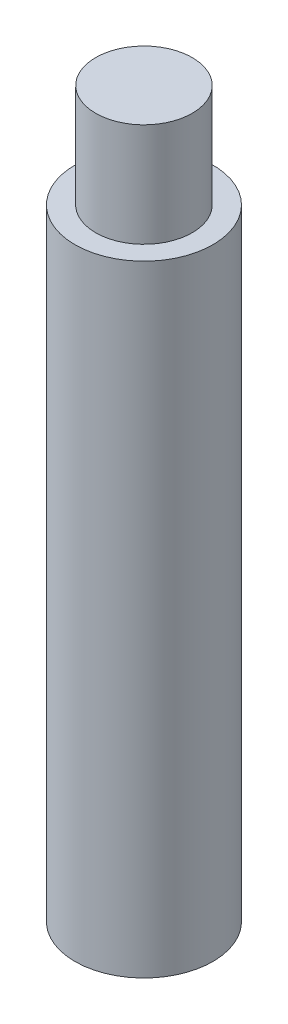
ISO-10303-21;
HEADER;
FILE_DESCRIPTION(('STEP AP214'),'2;1');
FILE_NAME('part.step','',(''),(''),'','','');
FILE_SCHEMA(('AUTOMOTIVE_DESIGN { 1 0 10303 214 1 1 1 1 }'));
ENDSEC;
DATA;
#1=APPLICATION_CONTEXT('core data for automotive mechanical design processes');
#2=APPLICATION_PROTOCOL_DEFINITION('international standard','automotive_design',2000,#1);
#3=PRODUCT_CONTEXT('',#1,'mechanical');
#4=PRODUCT('Part','Part','',(#3));
#5=PRODUCT_RELATED_PRODUCT_CATEGORY('part','',(#4));
#6=PRODUCT_DEFINITION_FORMATION('','',#4);
#7=PRODUCT_DEFINITION_CONTEXT('part definition',#1,'design');
#8=PRODUCT_DEFINITION('design','',#6,#7);
#9=PRODUCT_DEFINITION_SHAPE('','',#8);
#10=(LENGTH_UNIT() NAMED_UNIT(*) SI_UNIT(.MILLI.,.METRE.));
#11=(NAMED_UNIT(*) PLANE_ANGLE_UNIT() SI_UNIT($,.RADIAN.));
#12=(NAMED_UNIT(*) SI_UNIT($,.STERADIAN.) SOLID_ANGLE_UNIT());
#13=UNCERTAINTY_MEASURE_WITH_UNIT(LENGTH_MEASURE(1.E-05),#10,'distance_accuracy_value','');
#14=(GEOMETRIC_REPRESENTATION_CONTEXT(3) GLOBAL_UNCERTAINTY_ASSIGNED_CONTEXT((#13)) GLOBAL_UNIT_ASSIGNED_CONTEXT((#10,
#11,#12)) REPRESENTATION_CONTEXT('',''));
#15=CARTESIAN_POINT('',(0.,0.,0.));
#16=DIRECTION('',(0.,0.,1.));
#17=DIRECTION('',(1.,0.,0.));
#18=AXIS2_PLACEMENT_3D('',#15,#16,#17);
#19=CARTESIAN_POINT('',(0.,0.,0.));
#20=DIRECTION('',(0.,1.,0.));
#21=DIRECTION('',(0.,0.,1.));
#22=AXIS2_PLACEMENT_3D('',#19,#20,#21);
#23=PLANE('',#22);
#24=CARTESIAN_POINT('',(0.,0.,0.));
#25=DIRECTION('',(0.,1.,0.));
#26=DIRECTION('',(0.,0.,1.));
#27=AXIS2_PLACEMENT_3D('',#24,#25,#26);
#28=CIRCLE('',#27,2.);
#29=CARTESIAN_POINT('',(0.,0.,2.));
#30=VERTEX_POINT('',#29);
#31=EDGE_CURVE('E42',#30,#30,#28,.T.);
#32=ORIENTED_EDGE('',*,*,#31,.T.);
#33=EDGE_LOOP('',(#32));
#34=FACE_BOUND('',#33,.T.);
#35=CARTESIAN_POINT('',(0.,0.,0.));
#36=DIRECTION('',(0.,1.,0.));
#37=DIRECTION('',(0.,0.,1.));
#38=AXIS2_PLACEMENT_3D('',#35,#36,#37);
#39=CIRCLE('',#38,1.4);
#40=CARTESIAN_POINT('',(0.,0.,1.4));
#41=VERTEX_POINT('',#40);
#42=EDGE_CURVE('E58',#41,#41,#39,.T.);
#43=ORIENTED_EDGE('',*,*,#42,.F.);
#44=EDGE_LOOP('',(#43));
#45=FACE_BOUND('',#44,.T.);
#46=ADVANCED_FACE('F38',(#34,#45),#23,.T.);
#47=CARTESIAN_POINT('',(0.,-18.,0.));
#48=DIRECTION('',(0.,1.,0.));
#49=DIRECTION('',(0.,0.,1.));
#50=AXIS2_PLACEMENT_3D('',#47,#48,#49);
#51=CYLINDRICAL_SURFACE('',#50,2.);
#52=CARTESIAN_POINT('',(0.,-18.,0.));
#53=DIRECTION('',(0.,1.,0.));
#54=DIRECTION('',(0.,0.,1.));
#55=AXIS2_PLACEMENT_3D('',#52,#53,#54);
#56=CIRCLE('',#55,2.);
#57=CARTESIAN_POINT('',(0.,-18.,2.));
#58=VERTEX_POINT('',#57);
#59=EDGE_CURVE('E11',#58,#58,#56,.T.);
#60=ORIENTED_EDGE('',*,*,#59,.T.);
#61=EDGE_LOOP('',(#60));
#62=FACE_BOUND('',#61,.T.);
#63=ORIENTED_EDGE('',*,*,#31,.F.);
#64=EDGE_LOOP('',(#63));
#65=FACE_BOUND('',#64,.T.);
#66=ADVANCED_FACE('F40',(#62,#65),#51,.T.);
#67=CARTESIAN_POINT('',(0.,-18.,0.));
#68=DIRECTION('',(0.,1.,0.));
#69=DIRECTION('',(0.,0.,1.));
#70=AXIS2_PLACEMENT_3D('',#67,#68,#69);
#71=PLANE('',#70);
#72=CARTESIAN_POINT('',(0.,-18.,0.));
#73=DIRECTION('',(0.,-1.,0.));
#74=DIRECTION('',(0.,0.,-1.));
#75=AXIS2_PLACEMENT_3D('',#72,#73,#74);
#76=CIRCLE('',#75,1.24999999999999);
#77=CARTESIAN_POINT('',(0.,-18.,-1.24999999999999));
#78=VERTEX_POINT('',#77);
#79=EDGE_CURVE('E59',#78,#78,#76,.T.);
#80=ORIENTED_EDGE('',*,*,#79,.F.);
#81=EDGE_LOOP('',(#80));
#82=FACE_BOUND('',#81,.T.);
#83=ORIENTED_EDGE('',*,*,#59,.F.);
#84=EDGE_LOOP('',(#83));
#85=FACE_BOUND('',#84,.T.);
#86=ADVANCED_FACE('F76',(#82,#85),#71,.F.);
#87=CARTESIAN_POINT('',(0.,3.,0.));
#88=DIRECTION('',(0.,-1.,0.));
#89=DIRECTION('',(0.,0.,-1.));
#90=AXIS2_PLACEMENT_3D('',#87,#88,#89);
#91=CYLINDRICAL_SURFACE('',#90,1.4);
#92=CARTESIAN_POINT('',(0.,3.,0.));
#93=DIRECTION('',(0.,1.,0.));
#94=DIRECTION('',(0.,0.,1.));
#95=AXIS2_PLACEMENT_3D('',#92,#93,#94);
#96=CIRCLE('',#95,1.4);
#97=CARTESIAN_POINT('',(0.,3.,1.4));
#98=VERTEX_POINT('',#97);
#99=EDGE_CURVE('E62',#98,#98,#96,.T.);
#100=ORIENTED_EDGE('',*,*,#99,.F.);
#101=EDGE_LOOP('',(#100));
#102=FACE_BOUND('',#101,.T.);
#103=ORIENTED_EDGE('',*,*,#42,.T.);
#104=EDGE_LOOP('',(#103));
#105=FACE_BOUND('',#104,.T.);
#106=ADVANCED_FACE('F82',(#102,#105),#91,.T.);
#107=CARTESIAN_POINT('',(0.,3.,0.));
#108=DIRECTION('',(0.,1.,0.));
#109=DIRECTION('',(0.,0.,1.));
#110=AXIS2_PLACEMENT_3D('',#107,#108,#109);
#111=PLANE('',#110);
#112=ORIENTED_EDGE('',*,*,#99,.T.);
#113=EDGE_LOOP('',(#112));
#114=FACE_BOUND('',#113,.T.);
#115=ADVANCED_FACE('F52',(#114),#111,.T.);
#116=CARTESIAN_POINT('',(0.,-10.5,0.));
#117=DIRECTION('',(0.,-1.,0.));
#118=DIRECTION('',(0.,0.,-1.));
#119=AXIS2_PLACEMENT_3D('',#116,#117,#118);
#120=CONICAL_SURFACE('',#119,1.24999999999999,1.02974425867665);
#121=CARTESIAN_POINT('',(0.,-9.74892422621555,0.));
#122=VERTEX_POINT('',#121);
#123=VERTEX_LOOP('',#122);
#124=FACE_BOUND('',#123,.T.);
#125=CARTESIAN_POINT('',(0.,-10.5,0.));
#126=DIRECTION('',(0.,-1.,0.));
#127=DIRECTION('',(0.,0.,-1.));
#128=AXIS2_PLACEMENT_3D('',#125,#126,#127);
#129=CIRCLE('',#128,1.24999999999999);
#130=CARTESIAN_POINT('',(0.,-10.5,-1.24999999999999));
#131=VERTEX_POINT('',#130);
#132=EDGE_CURVE('E56',#131,#131,#129,.T.);
#133=ORIENTED_EDGE('',*,*,#132,.T.);
#134=EDGE_LOOP('',(#133));
#135=FACE_BOUND('',#134,.T.);
#136=ADVANCED_FACE('F48',(#124,#135),#120,.F.);
#137=CARTESIAN_POINT('',(0.,-18.,0.));
#138=DIRECTION('',(0.,-1.,0.));
#139=DIRECTION('',(0.,0.,-1.));
#140=AXIS2_PLACEMENT_3D('',#137,#138,#139);
#141=CYLINDRICAL_SURFACE('',#140,1.24999999999999);
#142=ORIENTED_EDGE('',*,*,#132,.F.);
#143=EDGE_LOOP('',(#142));
#144=FACE_BOUND('',#143,.T.);
#145=ORIENTED_EDGE('',*,*,#79,.T.);
#146=EDGE_LOOP('',(#145));
#147=FACE_BOUND('',#146,.T.);
#148=ADVANCED_FACE('F51',(#144,#147),#141,.F.);
#149=CLOSED_SHELL('',(#46,#66,#86,#106,#115,#136,#148));
#150=MANIFOLD_SOLID_BREP('B2',#149);
#151=ADVANCED_BREP_SHAPE_REPRESENTATION('',(#18,#150),#14);
#152=SHAPE_DEFINITION_REPRESENTATION(#9,#151);
ENDSEC;
END-ISO-10303-21;
